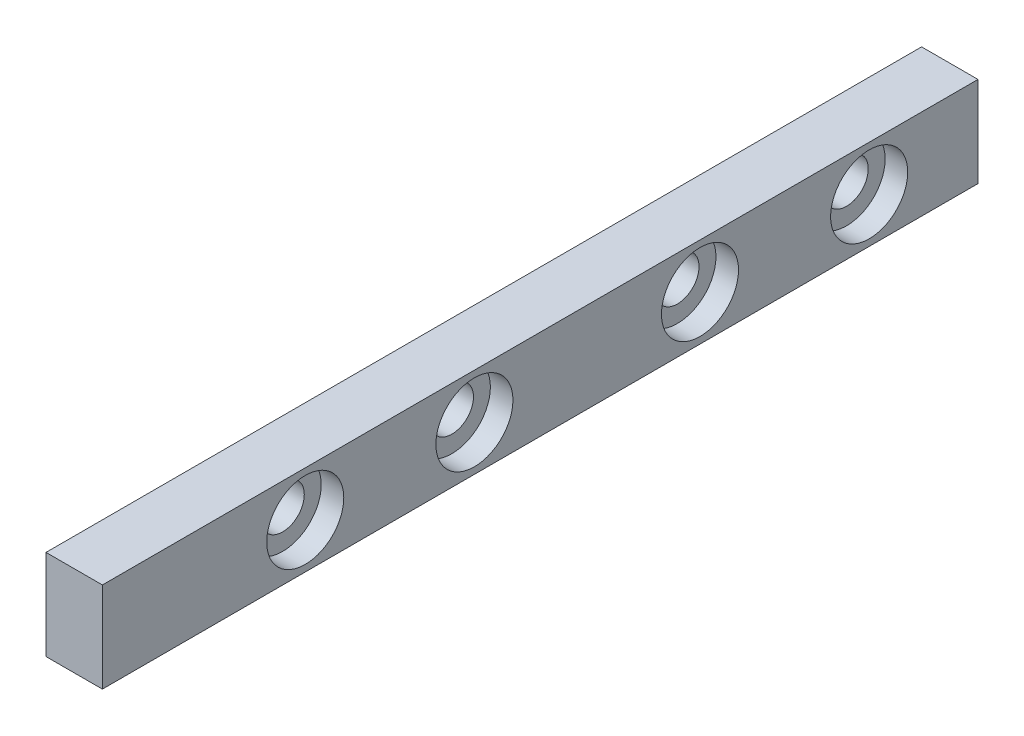
ISO-10303-21;
HEADER;
FILE_DESCRIPTION(('STEP AP214'),'2;1');
FILE_NAME('part.step','',(''),(''),'','','');
FILE_SCHEMA(('AUTOMOTIVE_DESIGN { 1 0 10303 214 1 1 1 1 }'));
ENDSEC;
DATA;
#1=APPLICATION_CONTEXT('core data for automotive mechanical design processes');
#2=APPLICATION_PROTOCOL_DEFINITION('international standard','automotive_design',2000,#1);
#3=PRODUCT_CONTEXT('',#1,'mechanical');
#4=PRODUCT('Part','Part','',(#3));
#5=PRODUCT_RELATED_PRODUCT_CATEGORY('part','',(#4));
#6=PRODUCT_DEFINITION_FORMATION('','',#4);
#7=PRODUCT_DEFINITION_CONTEXT('part definition',#1,'design');
#8=PRODUCT_DEFINITION('design','',#6,#7);
#9=PRODUCT_DEFINITION_SHAPE('','',#8);
#10=(LENGTH_UNIT() NAMED_UNIT(*) SI_UNIT(.MILLI.,.METRE.));
#11=(NAMED_UNIT(*) PLANE_ANGLE_UNIT() SI_UNIT($,.RADIAN.));
#12=(NAMED_UNIT(*) SI_UNIT($,.STERADIAN.) SOLID_ANGLE_UNIT());
#13=UNCERTAINTY_MEASURE_WITH_UNIT(LENGTH_MEASURE(1.E-05),#10,'distance_accuracy_value','');
#14=(GEOMETRIC_REPRESENTATION_CONTEXT(3) GLOBAL_UNCERTAINTY_ASSIGNED_CONTEXT((#13)) GLOBAL_UNIT_ASSIGNED_CONTEXT((#10,
#11,#12)) REPRESENTATION_CONTEXT('',''));
#15=CARTESIAN_POINT('',(0.,0.,0.));
#16=DIRECTION('',(0.,0.,1.));
#17=DIRECTION('',(1.,0.,0.));
#18=AXIS2_PLACEMENT_3D('',#15,#16,#17);
#19=CARTESIAN_POINT('',(3.,2.4,-14.79));
#20=DIRECTION('',(-1.,0.,0.));
#21=DIRECTION('',(0.,0.,1.));
#22=AXIS2_PLACEMENT_3D('',#19,#20,#21);
#23=CYLINDRICAL_SURFACE('',#22,1.15);
#24=CARTESIAN_POINT('',(0.,2.4,-14.79));
#25=DIRECTION('',(1.,0.,0.));
#26=DIRECTION('',(0.,0.,-1.));
#27=AXIS2_PLACEMENT_3D('',#24,#25,#26);
#28=CIRCLE('',#27,1.15);
#29=CARTESIAN_POINT('',(0.,2.4,-15.94));
#30=VERTEX_POINT('',#29);
#31=EDGE_CURVE('E146',#30,#30,#28,.T.);
#32=ORIENTED_EDGE('',*,*,#31,.F.);
#33=EDGE_LOOP('',(#32));
#34=FACE_BOUND('',#33,.T.);
#35=CARTESIAN_POINT('',(1.8,2.4,-14.79));
#36=DIRECTION('',(1.,0.,0.));
#37=DIRECTION('',(0.,0.,-1.));
#38=AXIS2_PLACEMENT_3D('',#35,#36,#37);
#39=CIRCLE('',#38,1.15);
#40=CARTESIAN_POINT('',(1.8,2.4,-15.94));
#41=VERTEX_POINT('',#40);
#42=EDGE_CURVE('E44',#41,#41,#39,.T.);
#43=ORIENTED_EDGE('',*,*,#42,.T.);
#44=EDGE_LOOP('',(#43));
#45=FACE_BOUND('',#44,.T.);
#46=ADVANCED_FACE('F40',(#34,#45),#23,.F.);
#47=CARTESIAN_POINT('',(3.,2.4,-5.79));
#48=DIRECTION('',(-1.,0.,0.));
#49=DIRECTION('',(0.,0.,1.));
#50=AXIS2_PLACEMENT_3D('',#47,#48,#49);
#51=CYLINDRICAL_SURFACE('',#50,1.15);
#52=CARTESIAN_POINT('',(0.,2.4,-5.79));
#53=DIRECTION('',(1.,0.,0.));
#54=DIRECTION('',(0.,0.,-1.));
#55=AXIS2_PLACEMENT_3D('',#52,#53,#54);
#56=CIRCLE('',#55,1.15);
#57=CARTESIAN_POINT('',(0.,2.4,-6.94));
#58=VERTEX_POINT('',#57);
#59=EDGE_CURVE('E143',#58,#58,#56,.T.);
#60=ORIENTED_EDGE('',*,*,#59,.F.);
#61=EDGE_LOOP('',(#60));
#62=FACE_BOUND('',#61,.T.);
#63=CARTESIAN_POINT('',(1.8,2.4,-5.79));
#64=DIRECTION('',(1.,0.,0.));
#65=DIRECTION('',(0.,0.,-1.));
#66=AXIS2_PLACEMENT_3D('',#63,#64,#65);
#67=CIRCLE('',#66,1.15);
#68=CARTESIAN_POINT('',(1.8,2.4,-6.94));
#69=VERTEX_POINT('',#68);
#70=EDGE_CURVE('E159',#69,#69,#67,.T.);
#71=ORIENTED_EDGE('',*,*,#70,.T.);
#72=EDGE_LOOP('',(#71));
#73=FACE_BOUND('',#72,.T.);
#74=ADVANCED_FACE('F207',(#62,#73),#51,.F.);
#75=CARTESIAN_POINT('',(3.,2.4,-26.79));
#76=DIRECTION('',(-1.,0.,0.));
#77=DIRECTION('',(0.,0.,1.));
#78=AXIS2_PLACEMENT_3D('',#75,#76,#77);
#79=CYLINDRICAL_SURFACE('',#78,1.15);
#80=CARTESIAN_POINT('',(0.,2.4,-26.79));
#81=DIRECTION('',(1.,0.,0.));
#82=DIRECTION('',(0.,0.,1.));
#83=AXIS2_PLACEMENT_3D('',#80,#81,#82);
#84=CIRCLE('',#83,1.15);
#85=CARTESIAN_POINT('',(0.,2.4,-25.64));
#86=VERTEX_POINT('',#85);
#87=EDGE_CURVE('E140',#86,#86,#84,.T.);
#88=ORIENTED_EDGE('',*,*,#87,.F.);
#89=EDGE_LOOP('',(#88));
#90=FACE_BOUND('',#89,.T.);
#91=CARTESIAN_POINT('',(1.8,2.4,-26.79));
#92=DIRECTION('',(1.,0.,0.));
#93=DIRECTION('',(0.,0.,-1.));
#94=AXIS2_PLACEMENT_3D('',#91,#92,#93);
#95=CIRCLE('',#94,1.15);
#96=CARTESIAN_POINT('',(1.8,2.4,-27.94));
#97=VERTEX_POINT('',#96);
#98=EDGE_CURVE('E157',#97,#97,#95,.T.);
#99=ORIENTED_EDGE('',*,*,#98,.T.);
#100=EDGE_LOOP('',(#99));
#101=FACE_BOUND('',#100,.T.);
#102=ADVANCED_FACE('F213',(#90,#101),#79,.F.);
#103=CARTESIAN_POINT('',(3.,2.4,-35.79));
#104=DIRECTION('',(-1.,0.,0.));
#105=DIRECTION('',(0.,0.,1.));
#106=AXIS2_PLACEMENT_3D('',#103,#104,#105);
#107=CYLINDRICAL_SURFACE('',#106,1.15);
#108=CARTESIAN_POINT('',(0.,2.4,-35.79));
#109=DIRECTION('',(1.,0.,0.));
#110=DIRECTION('',(0.,0.,1.));
#111=AXIS2_PLACEMENT_3D('',#108,#109,#110);
#112=CIRCLE('',#111,1.15);
#113=CARTESIAN_POINT('',(0.,2.4,-34.64));
#114=VERTEX_POINT('',#113);
#115=EDGE_CURVE('E137',#114,#114,#112,.T.);
#116=ORIENTED_EDGE('',*,*,#115,.F.);
#117=EDGE_LOOP('',(#116));
#118=FACE_BOUND('',#117,.T.);
#119=CARTESIAN_POINT('',(1.8,2.4,-35.79));
#120=DIRECTION('',(1.,0.,0.));
#121=DIRECTION('',(0.,0.,-1.));
#122=AXIS2_PLACEMENT_3D('',#119,#120,#121);
#123=CIRCLE('',#122,1.15);
#124=CARTESIAN_POINT('',(1.8,2.4,-36.94));
#125=VERTEX_POINT('',#124);
#126=EDGE_CURVE('E116',#125,#125,#123,.T.);
#127=ORIENTED_EDGE('',*,*,#126,.T.);
#128=EDGE_LOOP('',(#127));
#129=FACE_BOUND('',#128,.T.);
#130=ADVANCED_FACE('F183',(#118,#129),#107,.F.);
#131=CARTESIAN_POINT('',(3.,0.,0.));
#132=DIRECTION('',(-1.,0.,0.));
#133=DIRECTION('',(0.,0.,1.));
#134=AXIS2_PLACEMENT_3D('',#131,#132,#133);
#135=PLANE('',#134);
#136=CARTESIAN_POINT('',(3.,2.4,-5.79));
#137=DIRECTION('',(1.,0.,0.));
#138=DIRECTION('',(0.,0.,-1.));
#139=AXIS2_PLACEMENT_3D('',#136,#137,#138);
#140=CIRCLE('',#139,2.05);
#141=CARTESIAN_POINT('',(3.,2.4,-7.84));
#142=VERTEX_POINT('',#141);
#143=EDGE_CURVE('E117',#142,#142,#140,.T.);
#144=ORIENTED_EDGE('',*,*,#143,.F.);
#145=EDGE_LOOP('',(#144));
#146=FACE_BOUND('',#145,.T.);
#147=CARTESIAN_POINT('',(3.,2.4,-14.79));
#148=DIRECTION('',(1.,0.,0.));
#149=DIRECTION('',(0.,0.,-1.));
#150=AXIS2_PLACEMENT_3D('',#147,#148,#149);
#151=CIRCLE('',#150,2.05);
#152=CARTESIAN_POINT('',(3.,2.4,-16.84));
#153=VERTEX_POINT('',#152);
#154=EDGE_CURVE('E120',#153,#153,#151,.T.);
#155=ORIENTED_EDGE('',*,*,#154,.F.);
#156=EDGE_LOOP('',(#155));
#157=FACE_BOUND('',#156,.T.);
#158=CARTESIAN_POINT('',(3.,2.4,-26.79));
#159=DIRECTION('',(1.,0.,0.));
#160=DIRECTION('',(0.,0.,-1.));
#161=AXIS2_PLACEMENT_3D('',#158,#159,#160);
#162=CIRCLE('',#161,2.05);
#163=CARTESIAN_POINT('',(3.,2.4,-28.84));
#164=VERTEX_POINT('',#163);
#165=EDGE_CURVE('E126',#164,#164,#162,.T.);
#166=ORIENTED_EDGE('',*,*,#165,.F.);
#167=EDGE_LOOP('',(#166));
#168=FACE_BOUND('',#167,.T.);
#169=CARTESIAN_POINT('',(3.,2.4,-35.79));
#170=DIRECTION('',(1.,0.,0.));
#171=DIRECTION('',(0.,0.,-1.));
#172=AXIS2_PLACEMENT_3D('',#169,#170,#171);
#173=CIRCLE('',#172,2.04999999999999);
#174=CARTESIAN_POINT('',(3.,2.4,-37.84));
#175=VERTEX_POINT('',#174);
#176=EDGE_CURVE('E132',#175,#175,#173,.T.);
#177=ORIENTED_EDGE('',*,*,#176,.F.);
#178=EDGE_LOOP('',(#177));
#179=FACE_BOUND('',#178,.T.);
#180=DIRECTION('',(0.,0.,1.));
#181=VECTOR('',#180,1.);
#182=CARTESIAN_POINT('',(3.,4.8,0.));
#183=LINE('',#182,#181);
#184=CARTESIAN_POINT('',(3.,4.8,-41.58));
#185=VERTEX_POINT('',#184);
#186=CARTESIAN_POINT('',(3.,4.8,5.));
#187=VERTEX_POINT('',#186);
#188=EDGE_CURVE('E75',#185,#187,#183,.T.);
#189=ORIENTED_EDGE('',*,*,#188,.T.);
#190=DIRECTION('',(0.,1.,0.));
#191=VECTOR('',#190,1.);
#192=CARTESIAN_POINT('',(3.,0.,5.));
#193=LINE('',#192,#191);
#194=CARTESIAN_POINT('',(3.,0.,5.));
#195=VERTEX_POINT('',#194);
#196=EDGE_CURVE('E107',#195,#187,#193,.T.);
#197=ORIENTED_EDGE('',*,*,#196,.F.);
#198=DIRECTION('',(0.,0.,-1.));
#199=VECTOR('',#198,1.);
#200=CARTESIAN_POINT('',(3.,0.,0.));
#201=LINE('',#200,#199);
#202=CARTESIAN_POINT('',(3.,0.,-41.58));
#203=VERTEX_POINT('',#202);
#204=EDGE_CURVE('E95',#195,#203,#201,.T.);
#205=ORIENTED_EDGE('',*,*,#204,.T.);
#206=DIRECTION('',(0.,1.,0.));
#207=VECTOR('',#206,1.);
#208=CARTESIAN_POINT('',(3.,0.,-41.58));
#209=LINE('',#208,#207);
#210=EDGE_CURVE('E59',#203,#185,#209,.T.);
#211=ORIENTED_EDGE('',*,*,#210,.T.);
#212=EDGE_LOOP('',(#189,#197,#205,#211));
#213=FACE_BOUND('',#212,.T.);
#214=ADVANCED_FACE('F180',(#146,#157,#168,#179,#213),#135,.F.);
#215=CARTESIAN_POINT('',(0.,0.,0.));
#216=DIRECTION('',(-1.,0.,0.));
#217=DIRECTION('',(0.,0.,1.));
#218=AXIS2_PLACEMENT_3D('',#215,#216,#217);
#219=PLANE('',#218);
#220=ORIENTED_EDGE('',*,*,#87,.T.);
#221=EDGE_LOOP('',(#220));
#222=FACE_BOUND('',#221,.T.);
#223=ORIENTED_EDGE('',*,*,#31,.T.);
#224=EDGE_LOOP('',(#223));
#225=FACE_BOUND('',#224,.T.);
#226=DIRECTION('',(0.,0.,-1.));
#227=VECTOR('',#226,1.);
#228=CARTESIAN_POINT('',(0.,0.,0.));
#229=LINE('',#228,#227);
#230=CARTESIAN_POINT('',(0.,0.,5.));
#231=VERTEX_POINT('',#230);
#232=CARTESIAN_POINT('',(0.,0.,-41.58));
#233=VERTEX_POINT('',#232);
#234=EDGE_CURVE('E70',#231,#233,#229,.T.);
#235=ORIENTED_EDGE('',*,*,#234,.F.);
#236=DIRECTION('',(0.,-1.,0.));
#237=VECTOR('',#236,1.);
#238=CARTESIAN_POINT('',(0.,4.8,5.));
#239=LINE('',#238,#237);
#240=CARTESIAN_POINT('',(0.,4.8,5.));
#241=VERTEX_POINT('',#240);
#242=EDGE_CURVE('E99',#241,#231,#239,.T.);
#243=ORIENTED_EDGE('',*,*,#242,.F.);
#244=DIRECTION('',(0.,0.,1.));
#245=VECTOR('',#244,1.);
#246=CARTESIAN_POINT('',(0.,4.8,0.));
#247=LINE('',#246,#245);
#248=CARTESIAN_POINT('',(0.,4.8,-41.58));
#249=VERTEX_POINT('',#248);
#250=EDGE_CURVE('E88',#249,#241,#247,.T.);
#251=ORIENTED_EDGE('',*,*,#250,.F.);
#252=DIRECTION('',(0.,1.,0.));
#253=VECTOR('',#252,1.);
#254=CARTESIAN_POINT('',(0.,0.,-41.58));
#255=LINE('',#254,#253);
#256=EDGE_CURVE('E96',#233,#249,#255,.T.);
#257=ORIENTED_EDGE('',*,*,#256,.F.);
#258=EDGE_LOOP('',(#235,#243,#251,#257));
#259=FACE_BOUND('',#258,.T.);
#260=ORIENTED_EDGE('',*,*,#59,.T.);
#261=EDGE_LOOP('',(#260));
#262=FACE_BOUND('',#261,.T.);
#263=ORIENTED_EDGE('',*,*,#115,.T.);
#264=EDGE_LOOP('',(#263));
#265=FACE_BOUND('',#264,.T.);
#266=ADVANCED_FACE('F100',(#222,#225,#259,#262,#265),#219,.T.);
#267=CARTESIAN_POINT('',(3.,0.,0.));
#268=DIRECTION('',(0.,1.,0.));
#269=DIRECTION('',(0.,0.,1.));
#270=AXIS2_PLACEMENT_3D('',#267,#268,#269);
#271=PLANE('',#270);
#272=ORIENTED_EDGE('',*,*,#234,.T.);
#273=DIRECTION('',(-1.,0.,0.));
#274=VECTOR('',#273,1.);
#275=CARTESIAN_POINT('',(3.,0.,-41.58));
#276=LINE('',#275,#274);
#277=EDGE_CURVE('E11',#203,#233,#276,.T.);
#278=ORIENTED_EDGE('',*,*,#277,.F.);
#279=ORIENTED_EDGE('',*,*,#204,.F.);
#280=DIRECTION('',(1.,0.,0.));
#281=VECTOR('',#280,1.);
#282=CARTESIAN_POINT('',(0.,0.,5.));
#283=LINE('',#282,#281);
#284=EDGE_CURVE('E104',#231,#195,#283,.T.);
#285=ORIENTED_EDGE('',*,*,#284,.F.);
#286=EDGE_LOOP('',(#272,#278,#279,#285));
#287=FACE_BOUND('',#286,.T.);
#288=ADVANCED_FACE('F42',(#287),#271,.F.);
#289=CARTESIAN_POINT('',(3.,0.,-41.58));
#290=DIRECTION('',(0.,0.,1.));
#291=DIRECTION('',(1.,0.,0.));
#292=AXIS2_PLACEMENT_3D('',#289,#290,#291);
#293=PLANE('',#292);
#294=ORIENTED_EDGE('',*,*,#256,.T.);
#295=DIRECTION('',(-1.,0.,0.));
#296=VECTOR('',#295,1.);
#297=CARTESIAN_POINT('',(3.,4.8,-41.58));
#298=LINE('',#297,#296);
#299=EDGE_CURVE('E50',#185,#249,#298,.T.);
#300=ORIENTED_EDGE('',*,*,#299,.F.);
#301=ORIENTED_EDGE('',*,*,#210,.F.);
#302=ORIENTED_EDGE('',*,*,#277,.T.);
#303=EDGE_LOOP('',(#294,#300,#301,#302));
#304=FACE_BOUND('',#303,.T.);
#305=ADVANCED_FACE('F202',(#304),#293,.F.);
#306=CARTESIAN_POINT('',(3.,4.8,0.));
#307=DIRECTION('',(0.,-1.,0.));
#308=DIRECTION('',(0.,0.,-1.));
#309=AXIS2_PLACEMENT_3D('',#306,#307,#308);
#310=PLANE('',#309);
#311=ORIENTED_EDGE('',*,*,#250,.T.);
#312=DIRECTION('',(-1.,0.,0.));
#313=VECTOR('',#312,1.);
#314=CARTESIAN_POINT('',(3.,4.8,5.));
#315=LINE('',#314,#313);
#316=EDGE_CURVE('E92',#187,#241,#315,.T.);
#317=ORIENTED_EDGE('',*,*,#316,.F.);
#318=ORIENTED_EDGE('',*,*,#188,.F.);
#319=ORIENTED_EDGE('',*,*,#299,.T.);
#320=EDGE_LOOP('',(#311,#317,#318,#319));
#321=FACE_BOUND('',#320,.T.);
#322=ADVANCED_FACE('F90',(#321),#310,.F.);
#323=CARTESIAN_POINT('',(1.8,2.4,-35.79));
#324=DIRECTION('',(1.,0.,0.));
#325=DIRECTION('',(0.,0.,-1.));
#326=AXIS2_PLACEMENT_3D('',#323,#324,#325);
#327=CYLINDRICAL_SURFACE('',#326,2.04999999999999);
#328=CARTESIAN_POINT('',(1.8,2.4,-35.79));
#329=DIRECTION('',(1.,0.,0.));
#330=DIRECTION('',(0.,0.,-1.));
#331=AXIS2_PLACEMENT_3D('',#328,#329,#330);
#332=CIRCLE('',#331,2.04999999999999);
#333=CARTESIAN_POINT('',(1.8,2.4,-37.84));
#334=VERTEX_POINT('',#333);
#335=EDGE_CURVE('E112',#334,#334,#332,.T.);
#336=ORIENTED_EDGE('',*,*,#335,.F.);
#337=EDGE_LOOP('',(#336));
#338=FACE_BOUND('',#337,.T.);
#339=ORIENTED_EDGE('',*,*,#176,.T.);
#340=EDGE_LOOP('',(#339));
#341=FACE_BOUND('',#340,.T.);
#342=ADVANCED_FACE('F190',(#338,#341),#327,.F.);
#343=CARTESIAN_POINT('',(1.8,2.4,-35.79));
#344=DIRECTION('',(1.,0.,0.));
#345=DIRECTION('',(0.,0.,-1.));
#346=AXIS2_PLACEMENT_3D('',#343,#344,#345);
#347=PLANE('',#346);
#348=ORIENTED_EDGE('',*,*,#126,.F.);
#349=EDGE_LOOP('',(#348));
#350=FACE_BOUND('',#349,.T.);
#351=ORIENTED_EDGE('',*,*,#335,.T.);
#352=EDGE_LOOP('',(#351));
#353=FACE_BOUND('',#352,.T.);
#354=ADVANCED_FACE('F192',(#350,#353),#347,.T.);
#355=CARTESIAN_POINT('',(1.8,2.4,-26.79));
#356=DIRECTION('',(1.,0.,0.));
#357=DIRECTION('',(0.,0.,-1.));
#358=AXIS2_PLACEMENT_3D('',#355,#356,#357);
#359=CYLINDRICAL_SURFACE('',#358,2.05);
#360=CARTESIAN_POINT('',(1.8,2.4,-26.79));
#361=DIRECTION('',(1.,0.,0.));
#362=DIRECTION('',(0.,0.,-1.));
#363=AXIS2_PLACEMENT_3D('',#360,#361,#362);
#364=CIRCLE('',#363,2.05);
#365=CARTESIAN_POINT('',(1.8,2.4,-28.84));
#366=VERTEX_POINT('',#365);
#367=EDGE_CURVE('E129',#366,#366,#364,.T.);
#368=ORIENTED_EDGE('',*,*,#367,.F.);
#369=EDGE_LOOP('',(#368));
#370=FACE_BOUND('',#369,.T.);
#371=ORIENTED_EDGE('',*,*,#165,.T.);
#372=EDGE_LOOP('',(#371));
#373=FACE_BOUND('',#372,.T.);
#374=ADVANCED_FACE('F199',(#370,#373),#359,.F.);
#375=CARTESIAN_POINT('',(1.8,2.4,-26.79));
#376=DIRECTION('',(1.,0.,0.));
#377=DIRECTION('',(0.,0.,-1.));
#378=AXIS2_PLACEMENT_3D('',#375,#376,#377);
#379=PLANE('',#378);
#380=ORIENTED_EDGE('',*,*,#98,.F.);
#381=EDGE_LOOP('',(#380));
#382=FACE_BOUND('',#381,.T.);
#383=ORIENTED_EDGE('',*,*,#367,.T.);
#384=EDGE_LOOP('',(#383));
#385=FACE_BOUND('',#384,.T.);
#386=ADVANCED_FACE('F315',(#382,#385),#379,.T.);
#387=CARTESIAN_POINT('',(1.8,2.4,-5.79));
#388=DIRECTION('',(1.,0.,0.));
#389=DIRECTION('',(0.,0.,-1.));
#390=AXIS2_PLACEMENT_3D('',#387,#388,#389);
#391=CYLINDRICAL_SURFACE('',#390,2.05);
#392=CARTESIAN_POINT('',(1.8,2.4,-5.79));
#393=DIRECTION('',(1.,0.,0.));
#394=DIRECTION('',(0.,0.,-1.));
#395=AXIS2_PLACEMENT_3D('',#392,#393,#394);
#396=CIRCLE('',#395,2.05);
#397=CARTESIAN_POINT('',(1.8,2.4,-7.84));
#398=VERTEX_POINT('',#397);
#399=EDGE_CURVE('E113',#398,#398,#396,.T.);
#400=ORIENTED_EDGE('',*,*,#399,.F.);
#401=EDGE_LOOP('',(#400));
#402=FACE_BOUND('',#401,.T.);
#403=ORIENTED_EDGE('',*,*,#143,.T.);
#404=EDGE_LOOP('',(#403));
#405=FACE_BOUND('',#404,.T.);
#406=ADVANCED_FACE('F326',(#402,#405),#391,.F.);
#407=CARTESIAN_POINT('',(1.8,2.4,-5.79));
#408=DIRECTION('',(1.,0.,0.));
#409=DIRECTION('',(0.,0.,-1.));
#410=AXIS2_PLACEMENT_3D('',#407,#408,#409);
#411=PLANE('',#410);
#412=ORIENTED_EDGE('',*,*,#70,.F.);
#413=EDGE_LOOP('',(#412));
#414=FACE_BOUND('',#413,.T.);
#415=ORIENTED_EDGE('',*,*,#399,.T.);
#416=EDGE_LOOP('',(#415));
#417=FACE_BOUND('',#416,.T.);
#418=ADVANCED_FACE('F176',(#414,#417),#411,.T.);
#419=CARTESIAN_POINT('',(1.8,2.4,-14.79));
#420=DIRECTION('',(1.,0.,0.));
#421=DIRECTION('',(0.,0.,-1.));
#422=AXIS2_PLACEMENT_3D('',#419,#420,#421);
#423=CYLINDRICAL_SURFACE('',#422,2.05);
#424=CARTESIAN_POINT('',(1.8,2.4,-14.79));
#425=DIRECTION('',(1.,0.,0.));
#426=DIRECTION('',(0.,0.,-1.));
#427=AXIS2_PLACEMENT_3D('',#424,#425,#426);
#428=CIRCLE('',#427,2.05);
#429=CARTESIAN_POINT('',(1.8,2.4,-16.84));
#430=VERTEX_POINT('',#429);
#431=EDGE_CURVE('E123',#430,#430,#428,.T.);
#432=ORIENTED_EDGE('',*,*,#431,.F.);
#433=EDGE_LOOP('',(#432));
#434=FACE_BOUND('',#433,.T.);
#435=ORIENTED_EDGE('',*,*,#154,.T.);
#436=EDGE_LOOP('',(#435));
#437=FACE_BOUND('',#436,.T.);
#438=ADVANCED_FACE('F170',(#434,#437),#423,.F.);
#439=CARTESIAN_POINT('',(1.8,2.4,-14.79));
#440=DIRECTION('',(1.,0.,0.));
#441=DIRECTION('',(0.,0.,-1.));
#442=AXIS2_PLACEMENT_3D('',#439,#440,#441);
#443=PLANE('',#442);
#444=ORIENTED_EDGE('',*,*,#42,.F.);
#445=EDGE_LOOP('',(#444));
#446=FACE_BOUND('',#445,.T.);
#447=ORIENTED_EDGE('',*,*,#431,.T.);
#448=EDGE_LOOP('',(#447));
#449=FACE_BOUND('',#448,.T.);
#450=ADVANCED_FACE('F167',(#446,#449),#443,.T.);
#451=CARTESIAN_POINT('',(0.,0.,5.));
#452=DIRECTION('',(0.,0.,1.));
#453=DIRECTION('',(1.,0.,0.));
#454=AXIS2_PLACEMENT_3D('',#451,#452,#453);
#455=PLANE('',#454);
#456=ORIENTED_EDGE('',*,*,#316,.T.);
#457=ORIENTED_EDGE('',*,*,#242,.T.);
#458=ORIENTED_EDGE('',*,*,#284,.T.);
#459=ORIENTED_EDGE('',*,*,#196,.T.);
#460=EDGE_LOOP('',(#456,#457,#458,#459));
#461=FACE_BOUND('',#460,.T.);
#462=ADVANCED_FACE('F106',(#461),#455,.T.);
#463=CLOSED_SHELL('',(#46,#74,#102,#130,#214,#266,#288,#305,#322,#342,#354,#374,#386,#406,#418,
#438,#450,#462));
#464=MANIFOLD_SOLID_BREP('B2',#463);
#465=ADVANCED_BREP_SHAPE_REPRESENTATION('',(#18,#464),#14);
#466=SHAPE_DEFINITION_REPRESENTATION(#9,#465);
ENDSEC;
END-ISO-10303-21;
